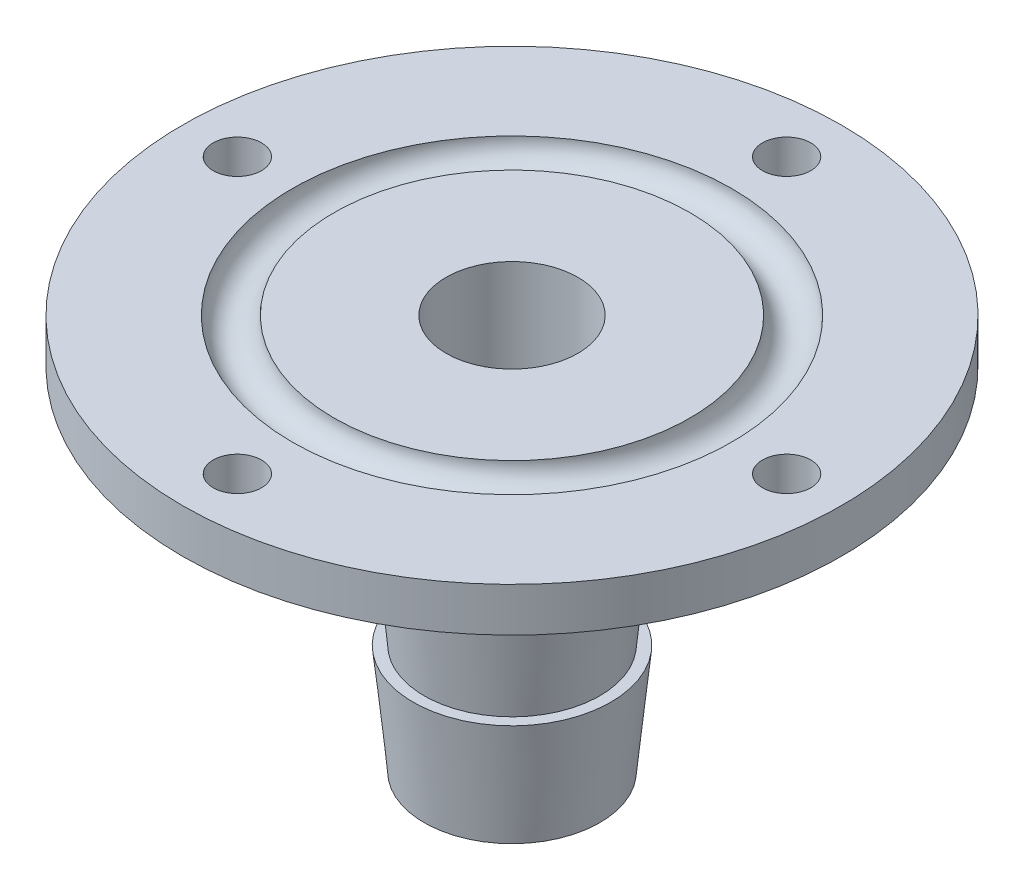
ISO-10303-21;
HEADER;
FILE_DESCRIPTION(('STEP AP214'),'2;1');
FILE_NAME('part.step','',(''),(''),'','','');
FILE_SCHEMA(('AUTOMOTIVE_DESIGN { 1 0 10303 214 1 1 1 1 }'));
ENDSEC;
DATA;
#1=APPLICATION_CONTEXT('core data for automotive mechanical design processes');
#2=APPLICATION_PROTOCOL_DEFINITION('international standard','automotive_design',2000,#1);
#3=PRODUCT_CONTEXT('',#1,'mechanical');
#4=PRODUCT('Part','Part','',(#3));
#5=PRODUCT_RELATED_PRODUCT_CATEGORY('part','',(#4));
#6=PRODUCT_DEFINITION_FORMATION('','',#4);
#7=PRODUCT_DEFINITION_CONTEXT('part definition',#1,'design');
#8=PRODUCT_DEFINITION('design','',#6,#7);
#9=PRODUCT_DEFINITION_SHAPE('','',#8);
#10=(LENGTH_UNIT() NAMED_UNIT(*) SI_UNIT(.MILLI.,.METRE.));
#11=(NAMED_UNIT(*) PLANE_ANGLE_UNIT() SI_UNIT($,.RADIAN.));
#12=(NAMED_UNIT(*) SI_UNIT($,.STERADIAN.) SOLID_ANGLE_UNIT());
#13=UNCERTAINTY_MEASURE_WITH_UNIT(LENGTH_MEASURE(1.E-05),#10,'distance_accuracy_value','');
#14=(GEOMETRIC_REPRESENTATION_CONTEXT(3) GLOBAL_UNCERTAINTY_ASSIGNED_CONTEXT((#13)) GLOBAL_UNIT_ASSIGNED_CONTEXT((#10,
#11,#12)) REPRESENTATION_CONTEXT('',''));
#15=CARTESIAN_POINT('',(0.,0.,0.));
#16=DIRECTION('',(0.,0.,1.));
#17=DIRECTION('',(1.,0.,0.));
#18=AXIS2_PLACEMENT_3D('',#15,#16,#17);
#19=CARTESIAN_POINT('',(0.,2.,0.));
#20=DIRECTION('',(0.,1.,0.));
#21=DIRECTION('',(0.,0.,1.));
#22=AXIS2_PLACEMENT_3D('',#19,#20,#21);
#23=PLANE('',#22);
#24=CARTESIAN_POINT('',(0.,2.,12.5));
#25=DIRECTION('',(0.,1.,0.));
#26=DIRECTION('',(0.,0.,1.));
#27=AXIS2_PLACEMENT_3D('',#24,#25,#26);
#28=CIRCLE('',#27,1.1);
#29=CARTESIAN_POINT('',(0.,2.,13.6));
#30=VERTEX_POINT('',#29);
#31=EDGE_CURVE('E135',#30,#30,#28,.T.);
#32=ORIENTED_EDGE('',*,*,#31,.F.);
#33=EDGE_LOOP('',(#32));
#34=FACE_BOUND('',#33,.T.);
#35=CARTESIAN_POINT('',(-12.5,2.,0.));
#36=DIRECTION('',(0.,1.,0.));
#37=DIRECTION('',(0.,0.,1.));
#38=AXIS2_PLACEMENT_3D('',#35,#36,#37);
#39=CIRCLE('',#38,1.1);
#40=CARTESIAN_POINT('',(-12.5,2.,1.09999999999991));
#41=VERTEX_POINT('',#40);
#42=EDGE_CURVE('E129',#41,#41,#39,.T.);
#43=ORIENTED_EDGE('',*,*,#42,.F.);
#44=EDGE_LOOP('',(#43));
#45=FACE_BOUND('',#44,.T.);
#46=CARTESIAN_POINT('',(1.30930550206618E-13,2.,-12.5));
#47=DIRECTION('',(0.,1.,0.));
#48=DIRECTION('',(0.,0.,1.));
#49=AXIS2_PLACEMENT_3D('',#46,#47,#48);
#50=CIRCLE('',#49,1.1);
#51=CARTESIAN_POINT('',(1.30930550206618E-13,2.,-11.4));
#52=VERTEX_POINT('',#51);
#53=EDGE_CURVE('E130',#52,#52,#50,.T.);
#54=ORIENTED_EDGE('',*,*,#53,.F.);
#55=EDGE_LOOP('',(#54));
#56=FACE_BOUND('',#55,.T.);
#57=CARTESIAN_POINT('',(12.5,2.,0.));
#58=DIRECTION('',(0.,1.,0.));
#59=DIRECTION('',(0.,0.,1.));
#60=AXIS2_PLACEMENT_3D('',#57,#58,#59);
#61=CIRCLE('',#60,1.1);
#62=CARTESIAN_POINT('',(12.5,2.,1.1));
#63=VERTEX_POINT('',#62);
#64=EDGE_CURVE('E124',#63,#63,#61,.T.);
#65=ORIENTED_EDGE('',*,*,#64,.F.);
#66=EDGE_LOOP('',(#65));
#67=FACE_BOUND('',#66,.T.);
#68=CARTESIAN_POINT('',(0.,2.,0.));
#69=DIRECTION('',(0.,1.,0.));
#70=DIRECTION('',(0.,0.,1.));
#71=AXIS2_PLACEMENT_3D('',#68,#69,#70);
#72=CIRCLE('',#71,15.);
#73=CARTESIAN_POINT('',(0.,2.,15.));
#74=VERTEX_POINT('',#73);
#75=EDGE_CURVE('E44',#74,#74,#72,.T.);
#76=ORIENTED_EDGE('',*,*,#75,.T.);
#77=EDGE_LOOP('',(#76));
#78=FACE_BOUND('',#77,.T.);
#79=CARTESIAN_POINT('',(0.,2.,0.));
#80=DIRECTION('',(0.,1.,0.));
#81=DIRECTION('',(0.,0.,1.));
#82=AXIS2_PLACEMENT_3D('',#79,#80,#81);
#83=CIRCLE('',#82,10.);
#84=CARTESIAN_POINT('',(0.,2.,10.));
#85=VERTEX_POINT('',#84);
#86=EDGE_CURVE('E60',#85,#85,#83,.T.);
#87=ORIENTED_EDGE('',*,*,#86,.F.);
#88=EDGE_LOOP('',(#87));
#89=FACE_BOUND('',#88,.T.);
#90=ADVANCED_FACE('F37',(#34,#45,#56,#67,#78,#89),#23,.T.);
#91=CARTESIAN_POINT('',(0.,2.,0.));
#92=DIRECTION('',(0.,1.,0.));
#93=DIRECTION('',(0.,0.,1.));
#94=AXIS2_PLACEMENT_3D('',#91,#92,#93);
#95=CIRCLE('',#94,3.);
#96=CARTESIAN_POINT('',(0.,2.,3.));
#97=VERTEX_POINT('',#96);
#98=EDGE_CURVE('E53',#97,#97,#95,.T.);
#99=ORIENTED_EDGE('',*,*,#98,.F.);
#100=EDGE_LOOP('',(#99));
#101=FACE_BOUND('',#100,.T.);
#102=CARTESIAN_POINT('',(0.,2.,0.));
#103=DIRECTION('',(0.,-1.,0.));
#104=DIRECTION('',(0.,0.,-1.));
#105=AXIS2_PLACEMENT_3D('',#102,#103,#104);
#106=CIRCLE('',#105,8.1);
#107=CARTESIAN_POINT('',(0.,2.,-8.1));
#108=VERTEX_POINT('',#107);
#109=EDGE_CURVE('E58',#108,#108,#106,.T.);
#110=ORIENTED_EDGE('',*,*,#109,.F.);
#111=EDGE_LOOP('',(#110));
#112=FACE_BOUND('',#111,.T.);
#113=ADVANCED_FACE('F71',(#101,#112),#23,.T.);
#114=CARTESIAN_POINT('',(0.,0.,0.));
#115=DIRECTION('',(0.,1.,0.));
#116=DIRECTION('',(0.,0.,1.));
#117=AXIS2_PLACEMENT_3D('',#114,#115,#116);
#118=PLANE('',#117);
#119=CARTESIAN_POINT('',(0.,0.,0.));
#120=DIRECTION('',(0.,1.,0.));
#121=DIRECTION('',(0.,0.,1.));
#122=AXIS2_PLACEMENT_3D('',#119,#120,#121);
#123=CIRCLE('',#122,3.99999999999998);
#124=CARTESIAN_POINT('',(0.,0.,3.99999999999998));
#125=VERTEX_POINT('',#124);
#126=EDGE_CURVE('E10',#125,#125,#123,.F.);
#127=ORIENTED_EDGE('',*,*,#126,.F.);
#128=EDGE_LOOP('',(#127));
#129=FACE_BOUND('',#128,.T.);
#130=CARTESIAN_POINT('',(0.,0.,12.5));
#131=DIRECTION('',(0.,1.,0.));
#132=DIRECTION('',(0.,0.,1.));
#133=AXIS2_PLACEMENT_3D('',#130,#131,#132);
#134=CIRCLE('',#133,1.1);
#135=CARTESIAN_POINT('',(0.,0.,13.6));
#136=VERTEX_POINT('',#135);
#137=EDGE_CURVE('E109',#136,#136,#134,.F.);
#138=ORIENTED_EDGE('',*,*,#137,.F.);
#139=EDGE_LOOP('',(#138));
#140=FACE_BOUND('',#139,.T.);
#141=CARTESIAN_POINT('',(-12.5,0.,0.));
#142=DIRECTION('',(0.,1.,0.));
#143=DIRECTION('',(0.,0.,1.));
#144=AXIS2_PLACEMENT_3D('',#141,#142,#143);
#145=CIRCLE('',#144,1.1);
#146=CARTESIAN_POINT('',(-12.5,0.,1.09999999999991));
#147=VERTEX_POINT('',#146);
#148=EDGE_CURVE('E113',#147,#147,#145,.F.);
#149=ORIENTED_EDGE('',*,*,#148,.F.);
#150=EDGE_LOOP('',(#149));
#151=FACE_BOUND('',#150,.T.);
#152=CARTESIAN_POINT('',(1.30930550206618E-13,0.,-12.5));
#153=DIRECTION('',(0.,1.,0.));
#154=DIRECTION('',(0.,0.,1.));
#155=AXIS2_PLACEMENT_3D('',#152,#153,#154);
#156=CIRCLE('',#155,1.1);
#157=CARTESIAN_POINT('',(1.30930550206618E-13,0.,-11.4));
#158=VERTEX_POINT('',#157);
#159=EDGE_CURVE('E117',#158,#158,#156,.F.);
#160=ORIENTED_EDGE('',*,*,#159,.F.);
#161=EDGE_LOOP('',(#160));
#162=FACE_BOUND('',#161,.T.);
#163=CARTESIAN_POINT('',(12.5,0.,0.));
#164=DIRECTION('',(0.,1.,0.));
#165=DIRECTION('',(0.,0.,1.));
#166=AXIS2_PLACEMENT_3D('',#163,#164,#165);
#167=CIRCLE('',#166,1.1);
#168=CARTESIAN_POINT('',(12.5,0.,1.1));
#169=VERTEX_POINT('',#168);
#170=EDGE_CURVE('E61',#169,#169,#167,.F.);
#171=ORIENTED_EDGE('',*,*,#170,.F.);
#172=EDGE_LOOP('',(#171));
#173=FACE_BOUND('',#172,.T.);
#174=CARTESIAN_POINT('',(0.,0.,0.));
#175=DIRECTION('',(0.,1.,0.));
#176=DIRECTION('',(0.,0.,1.));
#177=AXIS2_PLACEMENT_3D('',#174,#175,#176);
#178=CIRCLE('',#177,15.);
#179=CARTESIAN_POINT('',(0.,0.,15.));
#180=VERTEX_POINT('',#179);
#181=EDGE_CURVE('E48',#180,#180,#178,.T.);
#182=ORIENTED_EDGE('',*,*,#181,.F.);
#183=EDGE_LOOP('',(#182));
#184=FACE_BOUND('',#183,.T.);
#185=ADVANCED_FACE('F74',(#129,#140,#151,#162,#173,#184),#118,.F.);
#186=CARTESIAN_POINT('',(0.,2.,0.));
#187=DIRECTION('',(0.,-1.,0.));
#188=DIRECTION('',(0.,0.,-1.));
#189=AXIS2_PLACEMENT_3D('',#186,#187,#188);
#190=CYLINDRICAL_SURFACE('',#189,15.);
#191=ORIENTED_EDGE('',*,*,#75,.F.);
#192=EDGE_LOOP('',(#191));
#193=FACE_BOUND('',#192,.T.);
#194=ORIENTED_EDGE('',*,*,#181,.T.);
#195=EDGE_LOOP('',(#194));
#196=FACE_BOUND('',#195,.T.);
#197=ADVANCED_FACE('F39',(#193,#196),#190,.T.);
#198=CARTESIAN_POINT('',(0.,2.,0.));
#199=DIRECTION('',(0.,-1.,0.));
#200=DIRECTION('',(0.,0.,-1.));
#201=AXIS2_PLACEMENT_3D('',#198,#199,#200);
#202=CYLINDRICAL_SURFACE('',#201,3.);
#203=ORIENTED_EDGE('',*,*,#98,.T.);
#204=EDGE_LOOP('',(#203));
#205=FACE_BOUND('',#204,.T.);
#206=CARTESIAN_POINT('',(0.,-16.,0.));
#207=DIRECTION('',(0.,1.,0.));
#208=DIRECTION('',(0.,0.,1.));
#209=AXIS2_PLACEMENT_3D('',#206,#207,#208);
#210=CIRCLE('',#209,3.);
#211=CARTESIAN_POINT('',(0.,-16.,3.));
#212=VERTEX_POINT('',#211);
#213=EDGE_CURVE('E161',#212,#212,#210,.F.);
#214=ORIENTED_EDGE('',*,*,#213,.T.);
#215=EDGE_LOOP('',(#214));
#216=FACE_BOUND('',#215,.T.);
#217=ADVANCED_FACE('F68',(#205,#216),#202,.F.);
#218=CARTESIAN_POINT('',(0.,2.,0.));
#219=DIRECTION('',(0.,-1.,0.));
#220=DIRECTION('',(0.,0.,-1.));
#221=AXIS2_PLACEMENT_3D('',#218,#219,#220);
#222=TOROIDAL_SURFACE('',#221,9.05,0.950000000000001);
#223=ORIENTED_EDGE('',*,*,#86,.T.);
#224=EDGE_LOOP('',(#223));
#225=FACE_BOUND('',#224,.T.);
#226=ORIENTED_EDGE('',*,*,#109,.T.);
#227=EDGE_LOOP('',(#226));
#228=FACE_BOUND('',#227,.T.);
#229=ADVANCED_FACE('F78',(#225,#228),#222,.F.);
#230=CARTESIAN_POINT('',(12.5,-0.00100000000000013,0.));
#231=DIRECTION('',(0.,1.,0.));
#232=DIRECTION('',(0.,0.,1.));
#233=AXIS2_PLACEMENT_3D('',#230,#231,#232);
#234=CYLINDRICAL_SURFACE('',#233,1.1);
#235=ORIENTED_EDGE('',*,*,#64,.T.);
#236=EDGE_LOOP('',(#235));
#237=FACE_BOUND('',#236,.T.);
#238=ORIENTED_EDGE('',*,*,#170,.T.);
#239=EDGE_LOOP('',(#238));
#240=FACE_BOUND('',#239,.T.);
#241=ADVANCED_FACE('F80',(#237,#240),#234,.F.);
#242=CARTESIAN_POINT('',(1.30930550206618E-13,-0.00100000000000013,-12.5));
#243=DIRECTION('',(0.,1.,0.));
#244=DIRECTION('',(0.,0.,1.));
#245=AXIS2_PLACEMENT_3D('',#242,#243,#244);
#246=CYLINDRICAL_SURFACE('',#245,1.1);
#247=ORIENTED_EDGE('',*,*,#53,.T.);
#248=EDGE_LOOP('',(#247));
#249=FACE_BOUND('',#248,.T.);
#250=ORIENTED_EDGE('',*,*,#159,.T.);
#251=EDGE_LOOP('',(#250));
#252=FACE_BOUND('',#251,.T.);
#253=ADVANCED_FACE('F87',(#249,#252),#246,.F.);
#254=CARTESIAN_POINT('',(-12.5,-0.00100000000000013,0.));
#255=DIRECTION('',(0.,1.,0.));
#256=DIRECTION('',(0.,0.,1.));
#257=AXIS2_PLACEMENT_3D('',#254,#255,#256);
#258=CYLINDRICAL_SURFACE('',#257,1.1);
#259=ORIENTED_EDGE('',*,*,#42,.T.);
#260=EDGE_LOOP('',(#259));
#261=FACE_BOUND('',#260,.T.);
#262=ORIENTED_EDGE('',*,*,#148,.T.);
#263=EDGE_LOOP('',(#262));
#264=FACE_BOUND('',#263,.T.);
#265=ADVANCED_FACE('F203',(#261,#264),#258,.F.);
#266=CARTESIAN_POINT('',(0.,-0.00100000000000013,12.5));
#267=DIRECTION('',(0.,1.,0.));
#268=DIRECTION('',(0.,0.,1.));
#269=AXIS2_PLACEMENT_3D('',#266,#267,#268);
#270=CYLINDRICAL_SURFACE('',#269,1.1);
#271=ORIENTED_EDGE('',*,*,#31,.T.);
#272=EDGE_LOOP('',(#271));
#273=FACE_BOUND('',#272,.T.);
#274=ORIENTED_EDGE('',*,*,#137,.T.);
#275=EDGE_LOOP('',(#274));
#276=FACE_BOUND('',#275,.T.);
#277=ADVANCED_FACE('F199',(#273,#276),#270,.F.);
#278=CARTESIAN_POINT('',(0.,-6.,0.));
#279=DIRECTION('',(0.,1.,0.));
#280=DIRECTION('',(0.,0.,1.));
#281=AXIS2_PLACEMENT_3D('',#278,#279,#280);
#282=PLANE('',#281);
#283=CARTESIAN_POINT('',(0.,-6.,0.));
#284=DIRECTION('',(0.,-1.,0.));
#285=DIRECTION('',(0.,0.,-1.));
#286=AXIS2_PLACEMENT_3D('',#283,#284,#285);
#287=CIRCLE('',#286,3.99999999999998);
#288=CARTESIAN_POINT('',(0.,-6.,-3.99999999999998));
#289=VERTEX_POINT('',#288);
#290=EDGE_CURVE('E133',#289,#289,#287,.T.);
#291=ORIENTED_EDGE('',*,*,#290,.T.);
#292=EDGE_LOOP('',(#291));
#293=FACE_BOUND('',#292,.T.);
#294=CARTESIAN_POINT('',(0.,-6.,0.));
#295=DIRECTION('',(0.,-1.,0.));
#296=DIRECTION('',(0.,0.,-1.));
#297=AXIS2_PLACEMENT_3D('',#294,#295,#296);
#298=CIRCLE('',#297,4.49999999999998);
#299=CARTESIAN_POINT('',(0.,-6.,-4.49999999999998));
#300=VERTEX_POINT('',#299);
#301=EDGE_CURVE('E158',#300,#300,#298,.T.);
#302=ORIENTED_EDGE('',*,*,#301,.F.);
#303=EDGE_LOOP('',(#302));
#304=FACE_BOUND('',#303,.T.);
#305=ADVANCED_FACE('F195',(#293,#304),#282,.T.);
#306=CARTESIAN_POINT('',(0.,-6.,0.));
#307=DIRECTION('',(0.,1.,0.));
#308=DIRECTION('',(0.,0.,1.));
#309=AXIS2_PLACEMENT_3D('',#306,#307,#308);
#310=CONICAL_SURFACE('',#309,3.99999999999998,0.0996686524911585);
#311=CARTESIAN_POINT('',(0.,-0.999999999999999,0.));
#312=DIRECTION('',(0.,-1.,0.));
#313=DIRECTION('',(0.,0.,-1.));
#314=AXIS2_PLACEMENT_3D('',#311,#312,#313);
#315=CIRCLE('',#314,4.49999999999997);
#316=CARTESIAN_POINT('',(0.,-0.999999999999999,-4.49999999999997));
#317=VERTEX_POINT('',#316);
#318=EDGE_CURVE('E143',#317,#317,#315,.T.);
#319=ORIENTED_EDGE('',*,*,#318,.T.);
#320=EDGE_LOOP('',(#319));
#321=FACE_BOUND('',#320,.T.);
#322=ORIENTED_EDGE('',*,*,#290,.F.);
#323=EDGE_LOOP('',(#322));
#324=FACE_BOUND('',#323,.T.);
#325=ADVANCED_FACE('F191',(#321,#324),#310,.T.);
#326=CARTESIAN_POINT('',(0.,-0.999999999999999,0.));
#327=DIRECTION('',(0.,1.,0.));
#328=DIRECTION('',(0.,0.,1.));
#329=AXIS2_PLACEMENT_3D('',#326,#327,#328);
#330=PLANE('',#329);
#331=CARTESIAN_POINT('',(0.,-0.999999999999999,0.));
#332=DIRECTION('',(0.,-1.,0.));
#333=DIRECTION('',(0.,0.,-1.));
#334=AXIS2_PLACEMENT_3D('',#331,#332,#333);
#335=CIRCLE('',#334,3.99999999999997);
#336=CARTESIAN_POINT('',(0.,-0.999999999999999,-3.99999999999997));
#337=VERTEX_POINT('',#336);
#338=EDGE_CURVE('E146',#337,#337,#335,.T.);
#339=ORIENTED_EDGE('',*,*,#338,.T.);
#340=EDGE_LOOP('',(#339));
#341=FACE_BOUND('',#340,.T.);
#342=ORIENTED_EDGE('',*,*,#318,.F.);
#343=EDGE_LOOP('',(#342));
#344=FACE_BOUND('',#343,.T.);
#345=ADVANCED_FACE('F187',(#341,#344),#330,.T.);
#346=CARTESIAN_POINT('',(0.,-16.,0.));
#347=DIRECTION('',(0.,-1.,0.));
#348=DIRECTION('',(0.,0.,-1.));
#349=AXIS2_PLACEMENT_3D('',#346,#347,#348);
#350=CYLINDRICAL_SURFACE('',#349,3.99999999999998);
#351=ORIENTED_EDGE('',*,*,#338,.F.);
#352=EDGE_LOOP('',(#351));
#353=FACE_BOUND('',#352,.T.);
#354=ORIENTED_EDGE('',*,*,#126,.T.);
#355=EDGE_LOOP('',(#354));
#356=FACE_BOUND('',#355,.T.);
#357=ADVANCED_FACE('F169',(#353,#356),#350,.T.);
#358=CARTESIAN_POINT('',(0.,-16.,0.));
#359=DIRECTION('',(0.,1.,0.));
#360=DIRECTION('',(0.,0.,1.));
#361=AXIS2_PLACEMENT_3D('',#358,#359,#360);
#362=PLANE('',#361);
#363=ORIENTED_EDGE('',*,*,#213,.F.);
#364=EDGE_LOOP('',(#363));
#365=FACE_BOUND('',#364,.T.);
#366=CARTESIAN_POINT('',(0.,-16.,0.));
#367=DIRECTION('',(0.,-1.,0.));
#368=DIRECTION('',(0.,0.,-1.));
#369=AXIS2_PLACEMENT_3D('',#366,#367,#368);
#370=CIRCLE('',#369,4.);
#371=CARTESIAN_POINT('',(0.,-16.,-4.));
#372=VERTEX_POINT('',#371);
#373=EDGE_CURVE('E149',#372,#372,#370,.T.);
#374=ORIENTED_EDGE('',*,*,#373,.T.);
#375=EDGE_LOOP('',(#374));
#376=FACE_BOUND('',#375,.T.);
#377=ADVANCED_FACE('F165',(#365,#376),#362,.F.);
#378=CARTESIAN_POINT('',(0.,-16.,0.));
#379=DIRECTION('',(0.,1.,0.));
#380=DIRECTION('',(0.,0.,1.));
#381=AXIS2_PLACEMENT_3D('',#378,#379,#380);
#382=CONICAL_SURFACE('',#381,4.,0.099668652491162);
#383=CARTESIAN_POINT('',(0.,-11.,0.));
#384=DIRECTION('',(0.,-1.,0.));
#385=DIRECTION('',(0.,0.,-1.));
#386=AXIS2_PLACEMENT_3D('',#383,#384,#385);
#387=CIRCLE('',#386,4.5);
#388=CARTESIAN_POINT('',(0.,-11.,-4.5));
#389=VERTEX_POINT('',#388);
#390=EDGE_CURVE('E152',#389,#389,#387,.T.);
#391=ORIENTED_EDGE('',*,*,#390,.T.);
#392=EDGE_LOOP('',(#391));
#393=FACE_BOUND('',#392,.T.);
#394=ORIENTED_EDGE('',*,*,#373,.F.);
#395=EDGE_LOOP('',(#394));
#396=FACE_BOUND('',#395,.T.);
#397=ADVANCED_FACE('F168',(#393,#396),#382,.T.);
#398=CARTESIAN_POINT('',(0.,-11.,0.));
#399=DIRECTION('',(0.,1.,0.));
#400=DIRECTION('',(0.,0.,1.));
#401=AXIS2_PLACEMENT_3D('',#398,#399,#400);
#402=PLANE('',#401);
#403=CARTESIAN_POINT('',(0.,-11.,0.));
#404=DIRECTION('',(0.,-1.,0.));
#405=DIRECTION('',(0.,0.,-1.));
#406=AXIS2_PLACEMENT_3D('',#403,#404,#405);
#407=CIRCLE('',#406,3.99999999999998);
#408=CARTESIAN_POINT('',(0.,-11.,-3.99999999999998));
#409=VERTEX_POINT('',#408);
#410=EDGE_CURVE('E155',#409,#409,#407,.T.);
#411=ORIENTED_EDGE('',*,*,#410,.T.);
#412=EDGE_LOOP('',(#411));
#413=FACE_BOUND('',#412,.T.);
#414=ORIENTED_EDGE('',*,*,#390,.F.);
#415=EDGE_LOOP('',(#414));
#416=FACE_BOUND('',#415,.T.);
#417=ADVANCED_FACE('F174',(#413,#416),#402,.T.);
#418=CARTESIAN_POINT('',(0.,-11.,0.));
#419=DIRECTION('',(0.,1.,0.));
#420=DIRECTION('',(0.,0.,1.));
#421=AXIS2_PLACEMENT_3D('',#418,#419,#420);
#422=CONICAL_SURFACE('',#421,3.99999999999998,0.0996686524911621);
#423=ORIENTED_EDGE('',*,*,#301,.T.);
#424=EDGE_LOOP('',(#423));
#425=FACE_BOUND('',#424,.T.);
#426=ORIENTED_EDGE('',*,*,#410,.F.);
#427=EDGE_LOOP('',(#426));
#428=FACE_BOUND('',#427,.T.);
#429=ADVANCED_FACE('F180',(#425,#428),#422,.T.);
#430=CLOSED_SHELL('',(#90,#113,#185,#197,#217,#229,#241,#253,#265,#277,#305,#325,#345,#357,#377,
#397,#417,#429));
#431=MANIFOLD_SOLID_BREP('B2',#430);
#432=ADVANCED_BREP_SHAPE_REPRESENTATION('',(#18,#431),#14);
#433=SHAPE_DEFINITION_REPRESENTATION(#9,#432);
ENDSEC;
END-ISO-10303-21;
